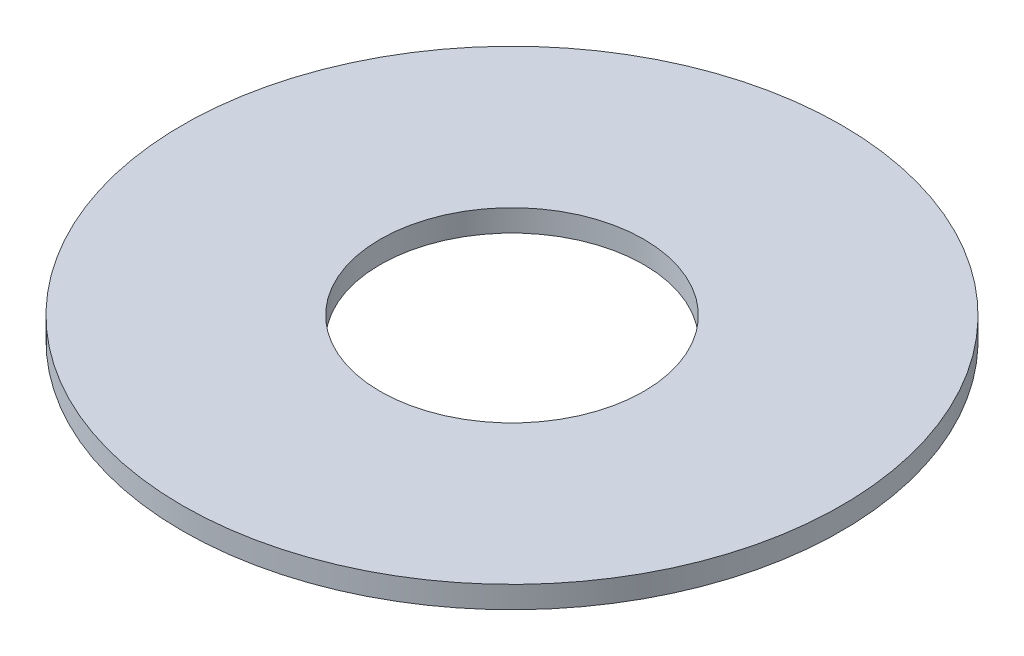
ISO-10303-21;
HEADER;
FILE_DESCRIPTION(('STEP AP214'),'2;1');
FILE_NAME('part.step','',(''),(''),'','','');
FILE_SCHEMA(('AUTOMOTIVE_DESIGN { 1 0 10303 214 1 1 1 1 }'));
ENDSEC;
DATA;
#1=APPLICATION_CONTEXT('core data for automotive mechanical design processes');
#2=APPLICATION_PROTOCOL_DEFINITION('international standard','automotive_design',2000,#1);
#3=PRODUCT_CONTEXT('',#1,'mechanical');
#4=PRODUCT('Part','Part','',(#3));
#5=PRODUCT_RELATED_PRODUCT_CATEGORY('part','',(#4));
#6=PRODUCT_DEFINITION_FORMATION('','',#4);
#7=PRODUCT_DEFINITION_CONTEXT('part definition',#1,'design');
#8=PRODUCT_DEFINITION('design','',#6,#7);
#9=PRODUCT_DEFINITION_SHAPE('','',#8);
#10=(LENGTH_UNIT() NAMED_UNIT(*) SI_UNIT(.MILLI.,.METRE.));
#11=(NAMED_UNIT(*) PLANE_ANGLE_UNIT() SI_UNIT($,.RADIAN.));
#12=(NAMED_UNIT(*) SI_UNIT($,.STERADIAN.) SOLID_ANGLE_UNIT());
#13=UNCERTAINTY_MEASURE_WITH_UNIT(LENGTH_MEASURE(1.E-05),#10,'distance_accuracy_value','');
#14=(GEOMETRIC_REPRESENTATION_CONTEXT(3) GLOBAL_UNCERTAINTY_ASSIGNED_CONTEXT((#13)) GLOBAL_UNIT_ASSIGNED_CONTEXT((#10,
#11,#12)) REPRESENTATION_CONTEXT('',''));
#15=CARTESIAN_POINT('',(0.,0.,0.));
#16=DIRECTION('',(0.,0.,1.));
#17=DIRECTION('',(1.,0.,0.));
#18=AXIS2_PLACEMENT_3D('',#15,#16,#17);
#19=CARTESIAN_POINT('',(0.,1.27,0.));
#20=DIRECTION('',(0.,1.,0.));
#21=DIRECTION('',(0.,0.,1.));
#22=AXIS2_PLACEMENT_3D('',#19,#20,#21);
#23=PLANE('',#22);
#24=CARTESIAN_POINT('',(0.,1.27,0.));
#25=DIRECTION('',(0.,1.,0.));
#26=DIRECTION('',(0.,0.,1.));
#27=AXIS2_PLACEMENT_3D('',#24,#25,#26);
#28=CIRCLE('',#27,19.05);
#29=CARTESIAN_POINT('',(0.,1.27,19.05));
#30=VERTEX_POINT('',#29);
#31=EDGE_CURVE('E10',#30,#30,#28,.T.);
#32=ORIENTED_EDGE('',*,*,#31,.T.);
#33=EDGE_LOOP('',(#32));
#34=FACE_BOUND('',#33,.T.);
#35=CARTESIAN_POINT('',(0.,1.27,0.));
#36=DIRECTION('',(0.,1.,0.));
#37=DIRECTION('',(0.,0.,1.));
#38=AXIS2_PLACEMENT_3D('',#35,#36,#37);
#39=CIRCLE('',#38,7.62);
#40=CARTESIAN_POINT('',(0.,1.27,7.62));
#41=VERTEX_POINT('',#40);
#42=EDGE_CURVE('E44',#41,#41,#39,.T.);
#43=ORIENTED_EDGE('',*,*,#42,.F.);
#44=EDGE_LOOP('',(#43));
#45=FACE_BOUND('',#44,.T.);
#46=ADVANCED_FACE('F33',(#34,#45),#23,.T.);
#47=CARTESIAN_POINT('',(0.,0.,0.));
#48=DIRECTION('',(0.,1.,0.));
#49=DIRECTION('',(0.,0.,1.));
#50=AXIS2_PLACEMENT_3D('',#47,#48,#49);
#51=PLANE('',#50);
#52=CARTESIAN_POINT('',(0.,0.,0.));
#53=DIRECTION('',(0.,1.,0.));
#54=DIRECTION('',(0.,0.,1.));
#55=AXIS2_PLACEMENT_3D('',#52,#53,#54);
#56=CIRCLE('',#55,19.05);
#57=CARTESIAN_POINT('',(0.,0.,19.05));
#58=VERTEX_POINT('',#57);
#59=EDGE_CURVE('E37',#58,#58,#56,.T.);
#60=ORIENTED_EDGE('',*,*,#59,.F.);
#61=EDGE_LOOP('',(#60));
#62=FACE_BOUND('',#61,.T.);
#63=CARTESIAN_POINT('',(0.,0.,0.));
#64=DIRECTION('',(0.,1.,0.));
#65=DIRECTION('',(0.,0.,1.));
#66=AXIS2_PLACEMENT_3D('',#63,#64,#65);
#67=CIRCLE('',#66,7.62);
#68=CARTESIAN_POINT('',(0.,0.,7.62));
#69=VERTEX_POINT('',#68);
#70=EDGE_CURVE('E46',#69,#69,#67,.T.);
#71=ORIENTED_EDGE('',*,*,#70,.T.);
#72=EDGE_LOOP('',(#71));
#73=FACE_BOUND('',#72,.T.);
#74=ADVANCED_FACE('F56',(#62,#73),#51,.F.);
#75=CARTESIAN_POINT('',(0.,1.27,0.));
#76=DIRECTION('',(0.,-1.,0.));
#77=DIRECTION('',(0.,0.,-1.));
#78=AXIS2_PLACEMENT_3D('',#75,#76,#77);
#79=CYLINDRICAL_SURFACE('',#78,19.05);
#80=ORIENTED_EDGE('',*,*,#31,.F.);
#81=EDGE_LOOP('',(#80));
#82=FACE_BOUND('',#81,.T.);
#83=ORIENTED_EDGE('',*,*,#59,.T.);
#84=EDGE_LOOP('',(#83));
#85=FACE_BOUND('',#84,.T.);
#86=ADVANCED_FACE('F35',(#82,#85),#79,.T.);
#87=CARTESIAN_POINT('',(0.,1.27,0.));
#88=DIRECTION('',(0.,-1.,0.));
#89=DIRECTION('',(0.,0.,-1.));
#90=AXIS2_PLACEMENT_3D('',#87,#88,#89);
#91=CYLINDRICAL_SURFACE('',#90,7.62);
#92=ORIENTED_EDGE('',*,*,#42,.T.);
#93=EDGE_LOOP('',(#92));
#94=FACE_BOUND('',#93,.T.);
#95=ORIENTED_EDGE('',*,*,#70,.F.);
#96=EDGE_LOOP('',(#95));
#97=FACE_BOUND('',#96,.T.);
#98=ADVANCED_FACE('F52',(#94,#97),#91,.F.);
#99=CLOSED_SHELL('',(#46,#74,#86,#98));
#100=MANIFOLD_SOLID_BREP('B2',#99);
#101=ADVANCED_BREP_SHAPE_REPRESENTATION('',(#18,#100),#14);
#102=SHAPE_DEFINITION_REPRESENTATION(#9,#101);
ENDSEC;
END-ISO-10303-21;
